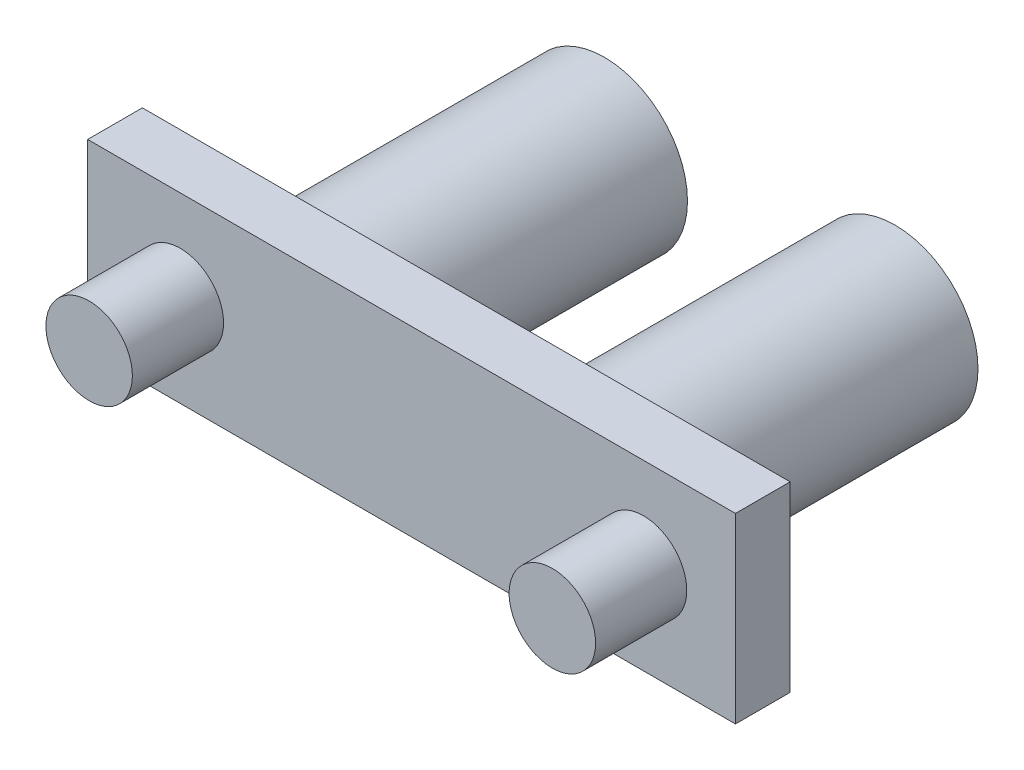
ISO-10303-21;
HEADER;
FILE_DESCRIPTION(('STEP AP214'),'2;1');
FILE_NAME('part.step','',(''),(''),'','','');
FILE_SCHEMA(('AUTOMOTIVE_DESIGN { 1 0 10303 214 1 1 1 1 }'));
ENDSEC;
DATA;
#1=APPLICATION_CONTEXT('core data for automotive mechanical design processes');
#2=APPLICATION_PROTOCOL_DEFINITION('international standard','automotive_design',2000,#1);
#3=PRODUCT_CONTEXT('',#1,'mechanical');
#4=PRODUCT('Part','Part','',(#3));
#5=PRODUCT_RELATED_PRODUCT_CATEGORY('part','',(#4));
#6=PRODUCT_DEFINITION_FORMATION('','',#4);
#7=PRODUCT_DEFINITION_CONTEXT('part definition',#1,'design');
#8=PRODUCT_DEFINITION('design','',#6,#7);
#9=PRODUCT_DEFINITION_SHAPE('','',#8);
#10=(LENGTH_UNIT() NAMED_UNIT(*) SI_UNIT(.MILLI.,.METRE.));
#11=(NAMED_UNIT(*) PLANE_ANGLE_UNIT() SI_UNIT($,.RADIAN.));
#12=(NAMED_UNIT(*) SI_UNIT($,.STERADIAN.) SOLID_ANGLE_UNIT());
#13=UNCERTAINTY_MEASURE_WITH_UNIT(LENGTH_MEASURE(1.E-05),#10,'distance_accuracy_value','');
#14=(GEOMETRIC_REPRESENTATION_CONTEXT(3) GLOBAL_UNCERTAINTY_ASSIGNED_CONTEXT((#13)) GLOBAL_UNIT_ASSIGNED_CONTEXT((#10,
#11,#12)) REPRESENTATION_CONTEXT('',''));
#15=CARTESIAN_POINT('',(0.,0.,0.));
#16=DIRECTION('',(0.,0.,1.));
#17=DIRECTION('',(1.,0.,0.));
#18=AXIS2_PLACEMENT_3D('',#15,#16,#17);
#19=CARTESIAN_POINT('',(0.,5.,1.5));
#20=DIRECTION('',(1.,0.,0.));
#21=DIRECTION('',(0.,1.,0.));
#22=AXIS2_PLACEMENT_3D('',#19,#20,#21);
#23=PLANE('',#22);
#24=DIRECTION('',(0.,-1.,0.));
#25=VECTOR('',#24,1.);
#26=CARTESIAN_POINT('',(0.,5.,0.));
#27=LINE('',#26,#25);
#28=CARTESIAN_POINT('',(0.,5.,0.));
#29=VERTEX_POINT('',#28);
#30=CARTESIAN_POINT('',(0.,0.,0.));
#31=VERTEX_POINT('',#30);
#32=EDGE_CURVE('E99',#29,#31,#27,.T.);
#33=ORIENTED_EDGE('',*,*,#32,.T.);
#34=DIRECTION('',(0.,0.,-1.));
#35=VECTOR('',#34,1.);
#36=CARTESIAN_POINT('',(0.,0.,1.5));
#37=LINE('',#36,#35);
#38=CARTESIAN_POINT('',(0.,0.,1.5));
#39=VERTEX_POINT('',#38);
#40=EDGE_CURVE('E90',#39,#31,#37,.T.);
#41=ORIENTED_EDGE('',*,*,#40,.F.);
#42=DIRECTION('',(0.,-1.,0.));
#43=VECTOR('',#42,1.);
#44=CARTESIAN_POINT('',(0.,5.,1.5));
#45=LINE('',#44,#43);
#46=CARTESIAN_POINT('',(0.,5.,1.5));
#47=VERTEX_POINT('',#46);
#48=EDGE_CURVE('E84',#47,#39,#45,.T.);
#49=ORIENTED_EDGE('',*,*,#48,.F.);
#50=DIRECTION('',(0.,0.,-1.));
#51=VECTOR('',#50,1.);
#52=CARTESIAN_POINT('',(0.,5.,1.5));
#53=LINE('',#52,#51);
#54=EDGE_CURVE('E95',#47,#29,#53,.T.);
#55=ORIENTED_EDGE('',*,*,#54,.T.);
#56=EDGE_LOOP('',(#33,#41,#49,#55));
#57=FACE_BOUND('',#56,.T.);
#58=ADVANCED_FACE('F32',(#57),#23,.F.);
#59=CARTESIAN_POINT('',(0.,0.,1.5));
#60=DIRECTION('',(0.,1.,0.));
#61=DIRECTION('',(0.,0.,1.));
#62=AXIS2_PLACEMENT_3D('',#59,#60,#61);
#63=PLANE('',#62);
#64=DIRECTION('',(1.,0.,0.));
#65=VECTOR('',#64,1.);
#66=CARTESIAN_POINT('',(0.,0.,0.));
#67=LINE('',#66,#65);
#68=CARTESIAN_POINT('',(17.76,0.,0.));
#69=VERTEX_POINT('',#68);
#70=EDGE_CURVE('E89',#31,#69,#67,.T.);
#71=ORIENTED_EDGE('',*,*,#70,.T.);
#72=DIRECTION('',(0.,0.,-1.));
#73=VECTOR('',#72,1.);
#74=CARTESIAN_POINT('',(17.76,0.,1.5));
#75=LINE('',#74,#73);
#76=CARTESIAN_POINT('',(17.76,0.,1.5));
#77=VERTEX_POINT('',#76);
#78=EDGE_CURVE('E87',#77,#69,#75,.T.);
#79=ORIENTED_EDGE('',*,*,#78,.F.);
#80=DIRECTION('',(1.,0.,0.));
#81=VECTOR('',#80,1.);
#82=CARTESIAN_POINT('',(0.,0.,1.5));
#83=LINE('',#82,#81);
#84=EDGE_CURVE('E79',#39,#77,#83,.T.);
#85=ORIENTED_EDGE('',*,*,#84,.F.);
#86=ORIENTED_EDGE('',*,*,#40,.T.);
#87=EDGE_LOOP('',(#71,#79,#85,#86));
#88=FACE_BOUND('',#87,.T.);
#89=ADVANCED_FACE('F88',(#88),#63,.F.);
#90=CARTESIAN_POINT('',(17.76,0.,1.5));
#91=DIRECTION('',(-1.,0.,0.));
#92=DIRECTION('',(0.,0.,1.));
#93=AXIS2_PLACEMENT_3D('',#90,#91,#92);
#94=PLANE('',#93);
#95=DIRECTION('',(0.,1.,0.));
#96=VECTOR('',#95,1.);
#97=CARTESIAN_POINT('',(17.76,0.,0.));
#98=LINE('',#97,#96);
#99=CARTESIAN_POINT('',(17.76,5.,0.));
#100=VERTEX_POINT('',#99);
#101=EDGE_CURVE('E65',#69,#100,#98,.T.);
#102=ORIENTED_EDGE('',*,*,#101,.T.);
#103=DIRECTION('',(0.,0.,-1.));
#104=VECTOR('',#103,1.);
#105=CARTESIAN_POINT('',(17.76,5.,1.5));
#106=LINE('',#105,#104);
#107=CARTESIAN_POINT('',(17.76,5.,1.5));
#108=VERTEX_POINT('',#107);
#109=EDGE_CURVE('E91',#108,#100,#106,.T.);
#110=ORIENTED_EDGE('',*,*,#109,.F.);
#111=DIRECTION('',(0.,1.,0.));
#112=VECTOR('',#111,1.);
#113=CARTESIAN_POINT('',(17.76,0.,1.5));
#114=LINE('',#113,#112);
#115=EDGE_CURVE('E82',#77,#108,#114,.T.);
#116=ORIENTED_EDGE('',*,*,#115,.F.);
#117=ORIENTED_EDGE('',*,*,#78,.T.);
#118=EDGE_LOOP('',(#102,#110,#116,#117));
#119=FACE_BOUND('',#118,.T.);
#120=ADVANCED_FACE('F93',(#119),#94,.F.);
#121=CARTESIAN_POINT('',(17.76,5.,1.5));
#122=DIRECTION('',(0.,-1.,0.));
#123=DIRECTION('',(1.,0.,0.));
#124=AXIS2_PLACEMENT_3D('',#121,#122,#123);
#125=PLANE('',#124);
#126=DIRECTION('',(-1.,0.,0.));
#127=VECTOR('',#126,1.);
#128=CARTESIAN_POINT('',(17.76,5.,0.));
#129=LINE('',#128,#127);
#130=EDGE_CURVE('E71',#100,#29,#129,.T.);
#131=ORIENTED_EDGE('',*,*,#130,.T.);
#132=ORIENTED_EDGE('',*,*,#54,.F.);
#133=DIRECTION('',(-1.,0.,0.));
#134=VECTOR('',#133,1.);
#135=CARTESIAN_POINT('',(17.76,5.,1.5));
#136=LINE('',#135,#134);
#137=EDGE_CURVE('E48',#108,#47,#136,.T.);
#138=ORIENTED_EDGE('',*,*,#137,.F.);
#139=ORIENTED_EDGE('',*,*,#109,.T.);
#140=EDGE_LOOP('',(#131,#132,#138,#139));
#141=FACE_BOUND('',#140,.T.);
#142=ADVANCED_FACE('F123',(#141),#125,.F.);
#143=CARTESIAN_POINT('',(0.,0.,1.5));
#144=DIRECTION('',(0.,0.,1.));
#145=DIRECTION('',(1.,0.,0.));
#146=AXIS2_PLACEMENT_3D('',#143,#144,#145);
#147=PLANE('',#146);
#148=CARTESIAN_POINT('',(15.24,2.5,1.5));
#149=DIRECTION('',(0.,0.,1.));
#150=DIRECTION('',(1.,0.,0.));
#151=AXIS2_PLACEMENT_3D('',#148,#149,#150);
#152=CIRCLE('',#151,1.185);
#153=CARTESIAN_POINT('',(16.425,2.5,1.5));
#154=VERTEX_POINT('',#153);
#155=EDGE_CURVE('E298',#154,#154,#152,.T.);
#156=ORIENTED_EDGE('',*,*,#155,.F.);
#157=EDGE_LOOP('',(#156));
#158=FACE_BOUND('',#157,.T.);
#159=CARTESIAN_POINT('',(2.54,2.5,1.5));
#160=DIRECTION('',(0.,0.,1.));
#161=DIRECTION('',(1.,0.,0.));
#162=AXIS2_PLACEMENT_3D('',#159,#160,#161);
#163=CIRCLE('',#162,1.185);
#164=CARTESIAN_POINT('',(3.725,2.5,1.5));
#165=VERTEX_POINT('',#164);
#166=EDGE_CURVE('E302',#165,#165,#163,.T.);
#167=ORIENTED_EDGE('',*,*,#166,.F.);
#168=EDGE_LOOP('',(#167));
#169=FACE_BOUND('',#168,.T.);
#170=ORIENTED_EDGE('',*,*,#48,.T.);
#171=ORIENTED_EDGE('',*,*,#84,.T.);
#172=ORIENTED_EDGE('',*,*,#115,.T.);
#173=ORIENTED_EDGE('',*,*,#137,.T.);
#174=EDGE_LOOP('',(#170,#171,#172,#173));
#175=FACE_BOUND('',#174,.T.);
#176=ADVANCED_FACE('F80',(#158,#169,#175),#147,.T.);
#177=CARTESIAN_POINT('',(0.,0.,0.));
#178=DIRECTION('',(0.,0.,1.));
#179=DIRECTION('',(1.,0.,0.));
#180=AXIS2_PLACEMENT_3D('',#177,#178,#179);
#181=PLANE('',#180);
#182=CARTESIAN_POINT('',(4.91,2.5,0.));
#183=DIRECTION('',(0.,0.,1.));
#184=DIRECTION('',(1.,0.,0.));
#185=AXIS2_PLACEMENT_3D('',#182,#183,#184);
#186=CIRCLE('',#185,2.275);
#187=CARTESIAN_POINT('',(7.185,2.5,0.));
#188=VERTEX_POINT('',#187);
#189=EDGE_CURVE('E11',#188,#188,#186,.F.);
#190=ORIENTED_EDGE('',*,*,#189,.F.);
#191=EDGE_LOOP('',(#190));
#192=FACE_BOUND('',#191,.T.);
#193=CARTESIAN_POINT('',(12.875,2.5,0.));
#194=DIRECTION('',(0.,0.,1.));
#195=DIRECTION('',(1.,0.,0.));
#196=AXIS2_PLACEMENT_3D('',#193,#194,#195);
#197=CIRCLE('',#196,2.275);
#198=CARTESIAN_POINT('',(15.15,2.5,0.));
#199=VERTEX_POINT('',#198);
#200=EDGE_CURVE('E40',#199,#199,#197,.F.);
#201=ORIENTED_EDGE('',*,*,#200,.F.);
#202=EDGE_LOOP('',(#201));
#203=FACE_BOUND('',#202,.T.);
#204=ORIENTED_EDGE('',*,*,#32,.F.);
#205=ORIENTED_EDGE('',*,*,#130,.F.);
#206=ORIENTED_EDGE('',*,*,#101,.F.);
#207=ORIENTED_EDGE('',*,*,#70,.F.);
#208=EDGE_LOOP('',(#204,#205,#206,#207));
#209=FACE_BOUND('',#208,.T.);
#210=ADVANCED_FACE('F113',(#192,#203,#209),#181,.F.);
#211=CARTESIAN_POINT('',(2.54,2.5,4.));
#212=DIRECTION('',(0.,0.,-1.));
#213=DIRECTION('',(-1.,0.,0.));
#214=AXIS2_PLACEMENT_3D('',#211,#212,#213);
#215=CYLINDRICAL_SURFACE('',#214,1.185);
#216=CARTESIAN_POINT('',(2.54,2.5,4.));
#217=DIRECTION('',(0.,0.,1.));
#218=DIRECTION('',(1.,0.,0.));
#219=AXIS2_PLACEMENT_3D('',#216,#217,#218);
#220=CIRCLE('',#219,1.185);
#221=CARTESIAN_POINT('',(3.725,2.5,4.));
#222=VERTEX_POINT('',#221);
#223=EDGE_CURVE('E102',#222,#222,#220,.T.);
#224=ORIENTED_EDGE('',*,*,#223,.F.);
#225=EDGE_LOOP('',(#224));
#226=FACE_BOUND('',#225,.T.);
#227=ORIENTED_EDGE('',*,*,#166,.T.);
#228=EDGE_LOOP('',(#227));
#229=FACE_BOUND('',#228,.T.);
#230=ADVANCED_FACE('F116',(#226,#229),#215,.T.);
#231=CARTESIAN_POINT('',(2.54,2.5,4.));
#232=DIRECTION('',(0.,0.,1.));
#233=DIRECTION('',(1.,0.,0.));
#234=AXIS2_PLACEMENT_3D('',#231,#232,#233);
#235=PLANE('',#234);
#236=ORIENTED_EDGE('',*,*,#223,.T.);
#237=EDGE_LOOP('',(#236));
#238=FACE_BOUND('',#237,.T.);
#239=ADVANCED_FACE('F163',(#238),#235,.T.);
#240=CARTESIAN_POINT('',(15.24,2.5,4.));
#241=DIRECTION('',(0.,0.,-1.));
#242=DIRECTION('',(-1.,0.,0.));
#243=AXIS2_PLACEMENT_3D('',#240,#241,#242);
#244=CYLINDRICAL_SURFACE('',#243,1.185);
#245=CARTESIAN_POINT('',(15.24,2.5,4.));
#246=DIRECTION('',(0.,0.,1.));
#247=DIRECTION('',(1.,0.,0.));
#248=AXIS2_PLACEMENT_3D('',#245,#246,#247);
#249=CIRCLE('',#248,1.185);
#250=CARTESIAN_POINT('',(16.425,2.5,4.));
#251=VERTEX_POINT('',#250);
#252=EDGE_CURVE('E299',#251,#251,#249,.T.);
#253=ORIENTED_EDGE('',*,*,#252,.F.);
#254=EDGE_LOOP('',(#253));
#255=FACE_BOUND('',#254,.T.);
#256=ORIENTED_EDGE('',*,*,#155,.T.);
#257=EDGE_LOOP('',(#256));
#258=FACE_BOUND('',#257,.T.);
#259=ADVANCED_FACE('F173',(#255,#258),#244,.T.);
#260=CARTESIAN_POINT('',(15.24,2.5,4.));
#261=DIRECTION('',(0.,0.,1.));
#262=DIRECTION('',(1.,0.,0.));
#263=AXIS2_PLACEMENT_3D('',#260,#261,#262);
#264=PLANE('',#263);
#265=ORIENTED_EDGE('',*,*,#252,.T.);
#266=EDGE_LOOP('',(#265));
#267=FACE_BOUND('',#266,.T.);
#268=ADVANCED_FACE('F183',(#267),#264,.T.);
#269=CARTESIAN_POINT('',(12.875,2.5,-7.76));
#270=DIRECTION('',(0.,0.,-1.));
#271=DIRECTION('',(-1.,0.,0.));
#272=AXIS2_PLACEMENT_3D('',#269,#270,#271);
#273=PLANE('',#272);
#274=CARTESIAN_POINT('',(12.875,2.5,-7.76));
#275=DIRECTION('',(0.,0.,-1.));
#276=DIRECTION('',(-1.,0.,0.));
#277=AXIS2_PLACEMENT_3D('',#274,#275,#276);
#278=CIRCLE('',#277,2.275);
#279=CARTESIAN_POINT('',(10.6,2.5,-7.76));
#280=VERTEX_POINT('',#279);
#281=EDGE_CURVE('E293',#280,#280,#278,.T.);
#282=ORIENTED_EDGE('',*,*,#281,.T.);
#283=EDGE_LOOP('',(#282));
#284=FACE_BOUND('',#283,.T.);
#285=CARTESIAN_POINT('',(12.875,2.5,-7.76));
#286=DIRECTION('',(0.,0.,-1.));
#287=DIRECTION('',(-1.,0.,0.));
#288=AXIS2_PLACEMENT_3D('',#285,#286,#287);
#289=CIRCLE('',#288,1.6);
#290=CARTESIAN_POINT('',(11.275,2.5,-7.76));
#291=VERTEX_POINT('',#290);
#292=EDGE_CURVE('E290',#291,#291,#289,.T.);
#293=ORIENTED_EDGE('',*,*,#292,.F.);
#294=EDGE_LOOP('',(#293));
#295=FACE_BOUND('',#294,.T.);
#296=ADVANCED_FACE('F193',(#284,#295),#273,.T.);
#297=CARTESIAN_POINT('',(12.875,2.5,-7.76));
#298=DIRECTION('',(0.,0.,1.));
#299=DIRECTION('',(1.,0.,0.));
#300=AXIS2_PLACEMENT_3D('',#297,#298,#299);
#301=CYLINDRICAL_SURFACE('',#300,2.275);
#302=ORIENTED_EDGE('',*,*,#281,.F.);
#303=EDGE_LOOP('',(#302));
#304=FACE_BOUND('',#303,.T.);
#305=ORIENTED_EDGE('',*,*,#200,.T.);
#306=EDGE_LOOP('',(#305));
#307=FACE_BOUND('',#306,.T.);
#308=ADVANCED_FACE('F111',(#304,#307),#301,.T.);
#309=CARTESIAN_POINT('',(12.875,2.5,-7.76));
#310=DIRECTION('',(0.,0.,1.));
#311=DIRECTION('',(1.,0.,0.));
#312=AXIS2_PLACEMENT_3D('',#309,#310,#311);
#313=CYLINDRICAL_SURFACE('',#312,1.6);
#314=ORIENTED_EDGE('',*,*,#292,.T.);
#315=EDGE_LOOP('',(#314));
#316=FACE_BOUND('',#315,.T.);
#317=CARTESIAN_POINT('',(12.875,2.5,0.));
#318=DIRECTION('',(0.,0.,-1.));
#319=DIRECTION('',(-1.,0.,0.));
#320=AXIS2_PLACEMENT_3D('',#317,#318,#319);
#321=CIRCLE('',#320,1.6);
#322=CARTESIAN_POINT('',(11.275,2.5,0.));
#323=VERTEX_POINT('',#322);
#324=EDGE_CURVE('E289',#323,#323,#321,.T.);
#325=ORIENTED_EDGE('',*,*,#324,.F.);
#326=EDGE_LOOP('',(#325));
#327=FACE_BOUND('',#326,.T.);
#328=ADVANCED_FACE('F219',(#316,#327),#313,.F.);
#329=ORIENTED_EDGE('',*,*,#324,.T.);
#330=EDGE_LOOP('',(#329));
#331=FACE_BOUND('',#330,.T.);
#332=ADVANCED_FACE('F120',(#331),#181,.F.);
#333=CARTESIAN_POINT('',(4.91,2.5,-7.76));
#334=DIRECTION('',(0.,0.,-1.));
#335=DIRECTION('',(-1.,0.,0.));
#336=AXIS2_PLACEMENT_3D('',#333,#334,#335);
#337=PLANE('',#336);
#338=CARTESIAN_POINT('',(4.91,2.5,-7.76));
#339=DIRECTION('',(0.,0.,-1.));
#340=DIRECTION('',(-1.,0.,0.));
#341=AXIS2_PLACEMENT_3D('',#338,#339,#340);
#342=CIRCLE('',#341,2.275);
#343=CARTESIAN_POINT('',(2.635,2.5,-7.76));
#344=VERTEX_POINT('',#343);
#345=EDGE_CURVE('E284',#344,#344,#342,.T.);
#346=ORIENTED_EDGE('',*,*,#345,.T.);
#347=EDGE_LOOP('',(#346));
#348=FACE_BOUND('',#347,.T.);
#349=CARTESIAN_POINT('',(4.91,2.5,-7.76));
#350=DIRECTION('',(0.,0.,-1.));
#351=DIRECTION('',(-1.,0.,0.));
#352=AXIS2_PLACEMENT_3D('',#349,#350,#351);
#353=CIRCLE('',#352,1.60151451282752);
#354=CARTESIAN_POINT('',(3.30848548717248,2.5,-7.76));
#355=VERTEX_POINT('',#354);
#356=EDGE_CURVE('E281',#355,#355,#353,.T.);
#357=ORIENTED_EDGE('',*,*,#356,.F.);
#358=EDGE_LOOP('',(#357));
#359=FACE_BOUND('',#358,.T.);
#360=ADVANCED_FACE('F238',(#348,#359),#337,.T.);
#361=CARTESIAN_POINT('',(4.91,2.5,-7.76));
#362=DIRECTION('',(0.,0.,1.));
#363=DIRECTION('',(1.,0.,0.));
#364=AXIS2_PLACEMENT_3D('',#361,#362,#363);
#365=CYLINDRICAL_SURFACE('',#364,2.275);
#366=ORIENTED_EDGE('',*,*,#345,.F.);
#367=EDGE_LOOP('',(#366));
#368=FACE_BOUND('',#367,.T.);
#369=ORIENTED_EDGE('',*,*,#189,.T.);
#370=EDGE_LOOP('',(#369));
#371=FACE_BOUND('',#370,.T.);
#372=ADVANCED_FACE('F246',(#368,#371),#365,.T.);
#373=CARTESIAN_POINT('',(4.91,2.5,-7.76));
#374=DIRECTION('',(0.,0.,1.));
#375=DIRECTION('',(1.,0.,0.));
#376=AXIS2_PLACEMENT_3D('',#373,#374,#375);
#377=CYLINDRICAL_SURFACE('',#376,1.60151451282752);
#378=ORIENTED_EDGE('',*,*,#356,.T.);
#379=EDGE_LOOP('',(#378));
#380=FACE_BOUND('',#379,.T.);
#381=CARTESIAN_POINT('',(4.91,2.5,0.));
#382=DIRECTION('',(0.,0.,-1.));
#383=DIRECTION('',(-1.,0.,0.));
#384=AXIS2_PLACEMENT_3D('',#381,#382,#383);
#385=CIRCLE('',#384,1.60151451282752);
#386=CARTESIAN_POINT('',(3.30848548717248,2.5,0.));
#387=VERTEX_POINT('',#386);
#388=EDGE_CURVE('E279',#387,#387,#385,.T.);
#389=ORIENTED_EDGE('',*,*,#388,.F.);
#390=EDGE_LOOP('',(#389));
#391=FACE_BOUND('',#390,.T.);
#392=ADVANCED_FACE('F256',(#380,#391),#377,.F.);
#393=ORIENTED_EDGE('',*,*,#388,.T.);
#394=EDGE_LOOP('',(#393));
#395=FACE_BOUND('',#394,.T.);
#396=ADVANCED_FACE('F119',(#395),#181,.F.);
#397=CLOSED_SHELL('',(#58,#89,#120,#142,#176,#210,#230,#239,#259,#268,#296,#308,#328,#332,#360,
#372,#392,#396));
#398=MANIFOLD_SOLID_BREP('B2',#397);
#399=ADVANCED_BREP_SHAPE_REPRESENTATION('',(#18,#398),#14);
#400=SHAPE_DEFINITION_REPRESENTATION(#9,#399);
ENDSEC;
END-ISO-10303-21;
